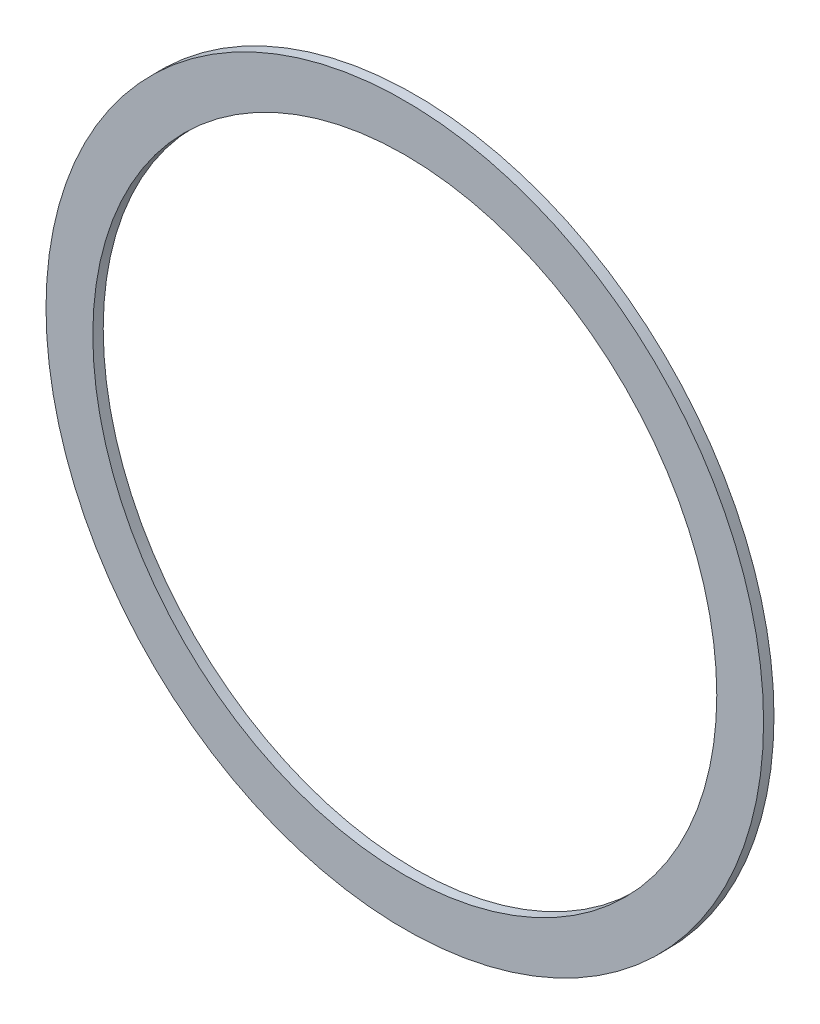
ISO-10303-21;
HEADER;
FILE_DESCRIPTION(('STEP AP214'),'2;1');
FILE_NAME('part.step','',(''),(''),'','','');
FILE_SCHEMA(('AUTOMOTIVE_DESIGN { 1 0 10303 214 1 1 1 1 }'));
ENDSEC;
DATA;
#1=APPLICATION_CONTEXT('core data for automotive mechanical design processes');
#2=APPLICATION_PROTOCOL_DEFINITION('international standard','automotive_design',2000,#1);
#3=PRODUCT_CONTEXT('',#1,'mechanical');
#4=PRODUCT('Part','Part','',(#3));
#5=PRODUCT_RELATED_PRODUCT_CATEGORY('part','',(#4));
#6=PRODUCT_DEFINITION_FORMATION('','',#4);
#7=PRODUCT_DEFINITION_CONTEXT('part definition',#1,'design');
#8=PRODUCT_DEFINITION('design','',#6,#7);
#9=PRODUCT_DEFINITION_SHAPE('','',#8);
#10=(LENGTH_UNIT() NAMED_UNIT(*) SI_UNIT(.MILLI.,.METRE.));
#11=(NAMED_UNIT(*) PLANE_ANGLE_UNIT() SI_UNIT($,.RADIAN.));
#12=(NAMED_UNIT(*) SI_UNIT($,.STERADIAN.) SOLID_ANGLE_UNIT());
#13=UNCERTAINTY_MEASURE_WITH_UNIT(LENGTH_MEASURE(1.E-05),#10,'distance_accuracy_value','');
#14=(GEOMETRIC_REPRESENTATION_CONTEXT(3) GLOBAL_UNCERTAINTY_ASSIGNED_CONTEXT((#13)) GLOBAL_UNIT_ASSIGNED_CONTEXT((#10,
#11,#12)) REPRESENTATION_CONTEXT('',''));
#15=CARTESIAN_POINT('',(0.,0.,0.));
#16=DIRECTION('',(0.,0.,1.));
#17=DIRECTION('',(1.,0.,0.));
#18=AXIS2_PLACEMENT_3D('',#15,#16,#17);
#19=CARTESIAN_POINT('',(2.22044604925031E-13,0.,2.00000000000089));
#20=DIRECTION('',(0.,0.,0.999999999999999));
#21=DIRECTION('',(0.999999999999999,0.,0.));
#22=AXIS2_PLACEMENT_3D('',#19,#20,#21);
#23=PLANE('',#22);
#24=CARTESIAN_POINT('',(2.22044604925031E-13,0.,2.00000000000089));
#25=DIRECTION('',(0.,0.,0.999999999999999));
#26=DIRECTION('',(0.999999999999999,0.,0.));
#27=AXIS2_PLACEMENT_3D('',#24,#25,#26);
#28=CIRCLE('',#27,69.);
#29=CARTESIAN_POINT('',(-68.9999999999997,0.,2.00000000000083));
#30=VERTEX_POINT('',#29);
#31=EDGE_CURVE('E12',#30,#30,#28,.T.);
#32=ORIENTED_EDGE('',*,*,#31,.T.);
#33=EDGE_LOOP('',(#32));
#34=FACE_BOUND('',#33,.T.);
#35=CARTESIAN_POINT('',(2.22044604925031E-13,0.,2.00000000000089));
#36=DIRECTION('',(0.,0.,0.999999999999999));
#37=DIRECTION('',(0.999999999999999,0.,0.));
#38=AXIS2_PLACEMENT_3D('',#35,#36,#37);
#39=CIRCLE('',#38,60.);
#40=CARTESIAN_POINT('',(-59.9999999999997,0.,2.00000000000084));
#41=VERTEX_POINT('',#40);
#42=EDGE_CURVE('E56',#41,#41,#39,.T.);
#43=ORIENTED_EDGE('',*,*,#42,.F.);
#44=EDGE_LOOP('',(#43));
#45=FACE_BOUND('',#44,.T.);
#46=ADVANCED_FACE('F42',(#34,#45),#23,.T.);
#47=CARTESIAN_POINT('',(0.,0.,0.));
#48=DIRECTION('',(0.,0.,0.999999999999999));
#49=DIRECTION('',(0.999999999999999,0.,0.));
#50=AXIS2_PLACEMENT_3D('',#47,#48,#49);
#51=PLANE('',#50);
#52=CARTESIAN_POINT('',(0.,0.,0.));
#53=DIRECTION('',(0.,0.,0.999999999999999));
#54=DIRECTION('',(0.999999999999999,0.,0.));
#55=AXIS2_PLACEMENT_3D('',#52,#53,#54);
#56=CIRCLE('',#55,69.);
#57=CARTESIAN_POINT('',(-68.9999999999997,0.,0.));
#58=VERTEX_POINT('',#57);
#59=EDGE_CURVE('E46',#58,#58,#56,.T.);
#60=ORIENTED_EDGE('',*,*,#59,.F.);
#61=EDGE_LOOP('',(#60));
#62=FACE_BOUND('',#61,.T.);
#63=CARTESIAN_POINT('',(0.,0.,0.));
#64=DIRECTION('',(0.,0.,0.999999999999999));
#65=DIRECTION('',(0.999999999999999,0.,0.));
#66=AXIS2_PLACEMENT_3D('',#63,#64,#65);
#67=CIRCLE('',#66,60.);
#68=CARTESIAN_POINT('',(-59.9999999999997,0.,0.));
#69=VERTEX_POINT('',#68);
#70=EDGE_CURVE('E58',#69,#69,#67,.T.);
#71=ORIENTED_EDGE('',*,*,#70,.T.);
#72=EDGE_LOOP('',(#71));
#73=FACE_BOUND('',#72,.T.);
#74=ADVANCED_FACE('F71',(#62,#73),#51,.F.);
#75=CARTESIAN_POINT('',(2.22044604925031E-13,0.,2.00000000000089));
#76=DIRECTION('',(0.,0.,-0.999999999999999));
#77=DIRECTION('',(-0.999999999999999,0.,0.));
#78=AXIS2_PLACEMENT_3D('',#75,#76,#77);
#79=CYLINDRICAL_SURFACE('',#78,69.);
#80=CARTESIAN_POINT('',(-68.9999999999997,0.,2.00000000000083));
#81=CARTESIAN_POINT('',(-68.9999999999997,0.,1.97916666666749));
#82=CARTESIAN_POINT('',(-68.9999999999997,0.,1.95833333333415));
#83=CARTESIAN_POINT('',(-68.9999999999997,0.,1.91666666666746));
#84=CARTESIAN_POINT('',(-68.9999999999997,0.,1.89583333333412));
#85=CARTESIAN_POINT('',(-68.9999999999997,0.,1.85416666666743));
#86=CARTESIAN_POINT('',(-68.9999999999997,0.,1.83333333333409));
#87=CARTESIAN_POINT('',(-68.9999999999997,0.,1.7916666666674));
#88=CARTESIAN_POINT('',(-68.9999999999997,0.,1.77083333333406));
#89=CARTESIAN_POINT('',(-68.9999999999997,0.,1.72916666666738));
#90=CARTESIAN_POINT('',(-68.9999999999997,0.,1.70833333333403));
#91=CARTESIAN_POINT('',(-68.9999999999997,0.,1.66666666666735));
#92=CARTESIAN_POINT('',(-68.9999999999997,0.,1.64583333333401));
#93=CARTESIAN_POINT('',(-68.9999999999997,0.,1.60416666666732));
#94=CARTESIAN_POINT('',(-68.9999999999997,0.,1.58333333333398));
#95=CARTESIAN_POINT('',(-68.9999999999997,0.,1.54166666666729));
#96=CARTESIAN_POINT('',(-68.9999999999997,0.,1.52083333333395));
#97=CARTESIAN_POINT('',(-68.9999999999997,0.,1.47916666666727));
#98=CARTESIAN_POINT('',(-68.9999999999997,0.,1.45833333333392));
#99=CARTESIAN_POINT('',(-68.9999999999997,0.,1.41666666666724));
#100=CARTESIAN_POINT('',(-68.9999999999997,0.,1.3958333333339));
#101=CARTESIAN_POINT('',(-68.9999999999997,0.,1.35416666666721));
#102=CARTESIAN_POINT('',(-68.9999999999997,0.,1.33333333333387));
#103=CARTESIAN_POINT('',(-68.9999999999997,0.,1.29166666666718));
#104=CARTESIAN_POINT('',(-68.9999999999997,0.,1.27083333333384));
#105=CARTESIAN_POINT('',(-68.9999999999997,0.,1.22916666666715));
#106=CARTESIAN_POINT('',(-68.9999999999997,0.,1.20833333333381));
#107=CARTESIAN_POINT('',(-68.9999999999997,0.,1.16666666666713));
#108=CARTESIAN_POINT('',(-68.9999999999997,0.,1.14583333333378));
#109=CARTESIAN_POINT('',(-68.9999999999997,0.,1.1041666666671));
#110=CARTESIAN_POINT('',(-68.9999999999997,0.,1.08333333333376));
#111=CARTESIAN_POINT('',(-68.9999999999997,0.,1.04166666666707));
#112=CARTESIAN_POINT('',(-68.9999999999997,0.,1.02083333333373));
#113=CARTESIAN_POINT('',(-68.9999999999997,0.,0.979166666667043));
#114=CARTESIAN_POINT('',(-68.9999999999997,0.,0.958333333333701));
#115=CARTESIAN_POINT('',(-68.9999999999997,0.,0.916666666667015));
#116=CARTESIAN_POINT('',(-68.9999999999997,0.,0.895833333333673));
#117=CARTESIAN_POINT('',(-68.9999999999997,0.,0.854166666666987));
#118=CARTESIAN_POINT('',(-68.9999999999997,0.,0.833333333333645));
#119=CARTESIAN_POINT('',(-68.9999999999997,0.,0.79166666666696));
#120=CARTESIAN_POINT('',(-68.9999999999997,0.,0.770833333333617));
#121=CARTESIAN_POINT('',(-68.9999999999997,0.,0.729166666666932));
#122=CARTESIAN_POINT('',(-68.9999999999997,0.,0.708333333333589));
#123=CARTESIAN_POINT('',(-68.9999999999997,0.,0.666666666666904));
#124=CARTESIAN_POINT('',(-68.9999999999997,0.,0.645833333333562));
#125=CARTESIAN_POINT('',(-68.9999999999997,0.,0.604166666666876));
#126=CARTESIAN_POINT('',(-68.9999999999997,0.,0.583333333333534));
#127=CARTESIAN_POINT('',(-68.9999999999997,0.,0.541666666666848));
#128=CARTESIAN_POINT('',(-68.9999999999997,0.,0.520833333333506));
#129=CARTESIAN_POINT('',(-68.9999999999997,0.,0.479166666666821));
#130=CARTESIAN_POINT('',(-68.9999999999997,0.,0.458333333333478));
#131=CARTESIAN_POINT('',(-68.9999999999997,0.,0.416666666666793));
#132=CARTESIAN_POINT('',(-68.9999999999997,0.,0.39583333333345));
#133=CARTESIAN_POINT('',(-68.9999999999997,0.,0.354166666666765));
#134=CARTESIAN_POINT('',(-68.9999999999997,0.,0.333333333333423));
#135=CARTESIAN_POINT('',(-68.9999999999997,0.,0.291666666666737));
#136=CARTESIAN_POINT('',(-68.9999999999997,0.,0.270833333333395));
#137=CARTESIAN_POINT('',(-68.9999999999997,0.,0.229166666666709));
#138=CARTESIAN_POINT('',(-68.9999999999997,0.,0.208333333333367));
#139=CARTESIAN_POINT('',(-68.9999999999997,0.,0.166666666666682));
#140=CARTESIAN_POINT('',(-68.9999999999997,0.,0.145833333333339));
#141=CARTESIAN_POINT('',(-68.9999999999997,0.,0.104166666666654));
#142=CARTESIAN_POINT('',(-68.9999999999997,0.,0.0833333333333113));
#143=CARTESIAN_POINT('',(-68.9999999999997,0.,0.0416666666666259));
#144=CARTESIAN_POINT('',(-68.9999999999997,0.,0.0208333333332833));
#145=CARTESIAN_POINT('',(-68.9999999999997,0.,0.));
#146=B_SPLINE_CURVE_WITH_KNOTS('',3,(#80,#81,#82,#83,#84,#85,#86,#87,#88,#89,#90,#91,#92,#93,
#94,#95,#96,#97,#98,#99,#100,#101,#102,#103,#104,#105,#106,#107,#108,#109,#110,#111,#112,#113,
#114,#115,#116,#117,#118,#119,#120,#121,#122,#123,#124,#125,#126,#127,#128,#129,#130,#131,#132,
#133,#134,#135,#136,#137,#138,#139,#140,#141,#142,#143,#144,#145),.UNSPECIFIED.,.F.,.F.,(4,2,2,
2,2,2,2,2,2,2,2,2,2,2,2,2,2,2,2,2,2,2,2,2,2,2,2,2,2,2,2,2,4),(0.,0.0625000000000276,
0.125000000000055,0.187500000000083,0.250000000000111,0.312500000000139,0.375000000000167,
0.437500000000194,0.500000000000222,0.56250000000025,0.625000000000278,0.687500000000306,
0.750000000000334,0.812500000000361,0.875000000000389,0.937500000000417,1.00000000000044,
1.06250000000047,1.1250000000005,1.18750000000053,1.25000000000056,1.31250000000058,
1.37500000000061,1.43750000000064,1.50000000000067,1.56250000000069,1.62500000000072,
1.68750000000075,1.75000000000078,1.81250000000081,1.87500000000083,1.93750000000086,
2.00000000000089),.UNSPECIFIED.);
#147=EDGE_CURVE('BSEAM44',#30,#58,#146,.T.);
#148=ORIENTED_EDGE('',*,*,#31,.F.);
#149=ORIENTED_EDGE('',*,*,#59,.T.);
#150=ORIENTED_EDGE('',*,*,#147,.T.);
#151=ORIENTED_EDGE('',*,*,#147,.F.);
#152=EDGE_LOOP('',(#148,#150,#149,#151));
#153=FACE_BOUND('',#152,.T.);
#154=ADVANCED_FACE('F44',(#153),#79,.T.);
#155=CARTESIAN_POINT('',(2.22044604925031E-13,0.,2.00000000000089));
#156=DIRECTION('',(0.,0.,-0.999999999999999));
#157=DIRECTION('',(-0.999999999999999,0.,0.));
#158=AXIS2_PLACEMENT_3D('',#155,#156,#157);
#159=CYLINDRICAL_SURFACE('',#158,60.);
#160=CARTESIAN_POINT('',(-59.9999999999997,0.,2.00000000000084));
#161=CARTESIAN_POINT('',(-59.9999999999997,0.,1.9791666666675));
#162=CARTESIAN_POINT('',(-59.9999999999997,0.,1.95833333333415));
#163=CARTESIAN_POINT('',(-59.9999999999997,0.,1.91666666666747));
#164=CARTESIAN_POINT('',(-59.9999999999997,0.,1.89583333333413));
#165=CARTESIAN_POINT('',(-59.9999999999997,0.,1.85416666666744));
#166=CARTESIAN_POINT('',(-59.9999999999997,0.,1.8333333333341));
#167=CARTESIAN_POINT('',(-59.9999999999997,0.,1.79166666666741));
#168=CARTESIAN_POINT('',(-59.9999999999997,0.,1.77083333333407));
#169=CARTESIAN_POINT('',(-59.9999999999997,0.,1.72916666666738));
#170=CARTESIAN_POINT('',(-59.9999999999997,0.,1.70833333333404));
#171=CARTESIAN_POINT('',(-59.9999999999997,0.,1.66666666666736));
#172=CARTESIAN_POINT('',(-59.9999999999997,0.,1.64583333333401));
#173=CARTESIAN_POINT('',(-59.9999999999997,0.,1.60416666666733));
#174=CARTESIAN_POINT('',(-59.9999999999997,0.,1.58333333333399));
#175=CARTESIAN_POINT('',(-59.9999999999997,0.,1.5416666666673));
#176=CARTESIAN_POINT('',(-59.9999999999997,0.,1.52083333333396));
#177=CARTESIAN_POINT('',(-59.9999999999997,0.,1.47916666666727));
#178=CARTESIAN_POINT('',(-59.9999999999997,0.,1.45833333333393));
#179=CARTESIAN_POINT('',(-59.9999999999997,0.,1.41666666666725));
#180=CARTESIAN_POINT('',(-59.9999999999997,0.,1.3958333333339));
#181=CARTESIAN_POINT('',(-59.9999999999997,0.,1.35416666666722));
#182=CARTESIAN_POINT('',(-59.9999999999997,0.,1.33333333333387));
#183=CARTESIAN_POINT('',(-59.9999999999997,0.,1.29166666666719));
#184=CARTESIAN_POINT('',(-59.9999999999997,0.,1.27083333333385));
#185=CARTESIAN_POINT('',(-59.9999999999997,0.,1.22916666666716));
#186=CARTESIAN_POINT('',(-59.9999999999997,0.,1.20833333333382));
#187=CARTESIAN_POINT('',(-59.9999999999997,0.,1.16666666666713));
#188=CARTESIAN_POINT('',(-59.9999999999997,0.,1.14583333333379));
#189=CARTESIAN_POINT('',(-59.9999999999997,0.,1.10416666666711));
#190=CARTESIAN_POINT('',(-59.9999999999997,0.,1.08333333333376));
#191=CARTESIAN_POINT('',(-59.9999999999997,0.,1.04166666666708));
#192=CARTESIAN_POINT('',(-59.9999999999997,0.,1.02083333333374));
#193=CARTESIAN_POINT('',(-59.9999999999997,0.,0.979166666667051));
#194=CARTESIAN_POINT('',(-59.9999999999997,0.,0.958333333333708));
#195=CARTESIAN_POINT('',(-59.9999999999997,0.,0.916666666667023));
#196=CARTESIAN_POINT('',(-59.9999999999997,0.,0.89583333333368));
#197=CARTESIAN_POINT('',(-59.9999999999997,0.,0.854166666666995));
#198=CARTESIAN_POINT('',(-59.9999999999997,0.,0.833333333333652));
#199=CARTESIAN_POINT('',(-59.9999999999997,0.,0.791666666666967));
#200=CARTESIAN_POINT('',(-59.9999999999997,0.,0.770833333333625));
#201=CARTESIAN_POINT('',(-59.9999999999997,0.,0.729166666666939));
#202=CARTESIAN_POINT('',(-59.9999999999997,0.,0.708333333333597));
#203=CARTESIAN_POINT('',(-59.9999999999997,0.,0.666666666666911));
#204=CARTESIAN_POINT('',(-59.9999999999997,0.,0.645833333333569));
#205=CARTESIAN_POINT('',(-59.9999999999997,0.,0.604166666666884));
#206=CARTESIAN_POINT('',(-59.9999999999997,0.,0.583333333333541));
#207=CARTESIAN_POINT('',(-59.9999999999997,0.,0.541666666666856));
#208=CARTESIAN_POINT('',(-59.9999999999997,0.,0.520833333333513));
#209=CARTESIAN_POINT('',(-59.9999999999997,0.,0.479166666666828));
#210=CARTESIAN_POINT('',(-59.9999999999997,0.,0.458333333333485));
#211=CARTESIAN_POINT('',(-59.9999999999997,0.,0.4166666666668));
#212=CARTESIAN_POINT('',(-59.9999999999997,0.,0.395833333333458));
#213=CARTESIAN_POINT('',(-59.9999999999997,0.,0.354166666666772));
#214=CARTESIAN_POINT('',(-59.9999999999997,0.,0.33333333333343));
#215=CARTESIAN_POINT('',(-59.9999999999997,0.,0.291666666666745));
#216=CARTESIAN_POINT('',(-59.9999999999997,0.,0.270833333333402));
#217=CARTESIAN_POINT('',(-59.9999999999997,0.,0.229166666666717));
#218=CARTESIAN_POINT('',(-59.9999999999997,0.,0.208333333333374));
#219=CARTESIAN_POINT('',(-59.9999999999997,0.,0.166666666666689));
#220=CARTESIAN_POINT('',(-59.9999999999997,0.,0.145833333333347));
#221=CARTESIAN_POINT('',(-59.9999999999997,0.,0.104166666666661));
#222=CARTESIAN_POINT('',(-59.9999999999997,0.,0.0833333333333187));
#223=CARTESIAN_POINT('',(-59.9999999999997,0.,0.0416666666666333));
#224=CARTESIAN_POINT('',(-59.9999999999997,0.,0.0208333333332906));
#225=CARTESIAN_POINT('',(-59.9999999999997,0.,0.));
#226=B_SPLINE_CURVE_WITH_KNOTS('',3,(#160,#161,#162,#163,#164,#165,#166,#167,#168,#169,#170,
#171,#172,#173,#174,#175,#176,#177,#178,#179,#180,#181,#182,#183,#184,#185,#186,#187,#188,#189,
#190,#191,#192,#193,#194,#195,#196,#197,#198,#199,#200,#201,#202,#203,#204,#205,#206,#207,#208,
#209,#210,#211,#212,#213,#214,#215,#216,#217,#218,#219,#220,#221,#222,#223,#224,#225),
.UNSPECIFIED.,.F.,.F.,(4,2,2,2,2,2,2,2,2,2,2,2,2,2,2,2,2,2,2,2,2,2,2,2,2,2,2,2,2,2,2,2,4),(0.,
0.0625000000000276,0.125000000000055,0.187500000000083,0.250000000000111,0.312500000000139,
0.375000000000167,0.437500000000194,0.500000000000222,0.56250000000025,0.625000000000278,
0.687500000000306,0.750000000000334,0.812500000000361,0.875000000000389,0.937500000000417,
1.00000000000044,1.06250000000047,1.1250000000005,1.18750000000053,1.25000000000056,
1.31250000000058,1.37500000000061,1.43750000000064,1.50000000000067,1.56250000000069,
1.62500000000072,1.68750000000075,1.75000000000078,1.81250000000081,1.87500000000083,
1.93750000000086,2.00000000000089),.UNSPECIFIED.);
#227=EDGE_CURVE('BSEAM67',#41,#69,#226,.T.);
#228=ORIENTED_EDGE('',*,*,#42,.T.);
#229=ORIENTED_EDGE('',*,*,#70,.F.);
#230=ORIENTED_EDGE('',*,*,#227,.T.);
#231=ORIENTED_EDGE('',*,*,#227,.F.);
#232=EDGE_LOOP('',(#228,#230,#229,#231));
#233=FACE_BOUND('',#232,.T.);
#234=ADVANCED_FACE('F67',(#233),#159,.F.);
#235=CLOSED_SHELL('',(#46,#74,#154,#234));
#236=MANIFOLD_SOLID_BREP('B2',#235);
#237=ADVANCED_BREP_SHAPE_REPRESENTATION('',(#18,#236),#14);
#238=SHAPE_DEFINITION_REPRESENTATION(#9,#237);
ENDSEC;
END-ISO-10303-21;
